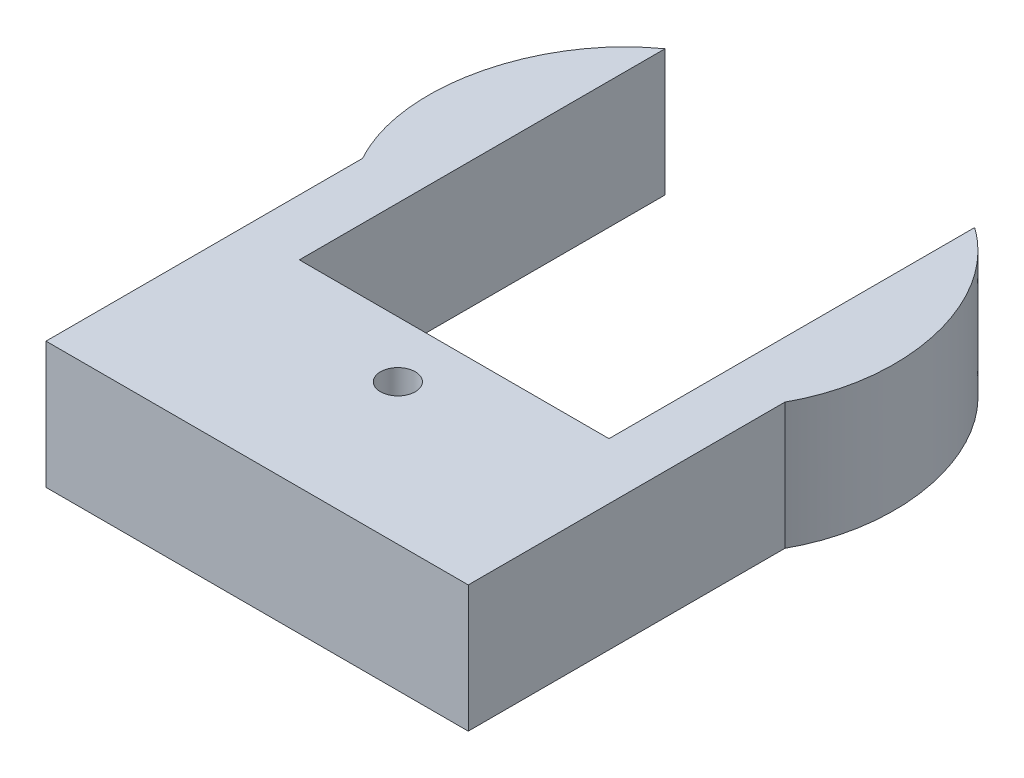
ISO-10303-21;
HEADER;
FILE_DESCRIPTION(('STEP AP214'),'2;1');
FILE_NAME('part.step','',(''),(''),'','','');
FILE_SCHEMA(('AUTOMOTIVE_DESIGN { 1 0 10303 214 1 1 1 1 }'));
ENDSEC;
DATA;
#1=APPLICATION_CONTEXT('core data for automotive mechanical design processes');
#2=APPLICATION_PROTOCOL_DEFINITION('international standard','automotive_design',2000,#1);
#3=PRODUCT_CONTEXT('',#1,'mechanical');
#4=PRODUCT('Part','Part','',(#3));
#5=PRODUCT_RELATED_PRODUCT_CATEGORY('part','',(#4));
#6=PRODUCT_DEFINITION_FORMATION('','',#4);
#7=PRODUCT_DEFINITION_CONTEXT('part definition',#1,'design');
#8=PRODUCT_DEFINITION('design','',#6,#7);
#9=PRODUCT_DEFINITION_SHAPE('','',#8);
#10=(LENGTH_UNIT() NAMED_UNIT(*) SI_UNIT(.MILLI.,.METRE.));
#11=(NAMED_UNIT(*) PLANE_ANGLE_UNIT() SI_UNIT($,.RADIAN.));
#12=(NAMED_UNIT(*) SI_UNIT($,.STERADIAN.) SOLID_ANGLE_UNIT());
#13=UNCERTAINTY_MEASURE_WITH_UNIT(LENGTH_MEASURE(1.E-05),#10,'distance_accuracy_value','');
#14=(GEOMETRIC_REPRESENTATION_CONTEXT(3) GLOBAL_UNCERTAINTY_ASSIGNED_CONTEXT((#13)) GLOBAL_UNIT_ASSIGNED_CONTEXT((#10,
#11,#12)) REPRESENTATION_CONTEXT('',''));
#15=CARTESIAN_POINT('',(0.,0.,0.));
#16=DIRECTION('',(0.,0.,1.));
#17=DIRECTION('',(1.,0.,0.));
#18=AXIS2_PLACEMENT_3D('',#15,#16,#17);
#19=CARTESIAN_POINT('',(0.,18.,0.));
#20=DIRECTION('',(0.,0.,-1.));
#21=DIRECTION('',(-1.,0.,0.));
#22=AXIS2_PLACEMENT_3D('',#19,#20,#21);
#23=PLANE('',#22);
#24=DIRECTION('',(1.,0.,0.));
#25=VECTOR('',#24,1.);
#26=CARTESIAN_POINT('',(0.,0.,0.));
#27=LINE('',#26,#25);
#28=CARTESIAN_POINT('',(0.,0.,0.));
#29=VERTEX_POINT('',#28);
#30=CARTESIAN_POINT('',(60.,0.,0.));
#31=VERTEX_POINT('',#30);
#32=EDGE_CURVE('E136',#29,#31,#27,.T.);
#33=ORIENTED_EDGE('',*,*,#32,.T.);
#34=DIRECTION('',(0.,-1.,0.));
#35=VECTOR('',#34,1.);
#36=CARTESIAN_POINT('',(60.,18.,0.));
#37=LINE('',#36,#35);
#38=CARTESIAN_POINT('',(60.,18.,0.));
#39=VERTEX_POINT('',#38);
#40=EDGE_CURVE('E41',#39,#31,#37,.T.);
#41=ORIENTED_EDGE('',*,*,#40,.F.);
#42=DIRECTION('',(1.,0.,0.));
#43=VECTOR('',#42,1.);
#44=CARTESIAN_POINT('',(0.,18.,0.));
#45=LINE('',#44,#43);
#46=CARTESIAN_POINT('',(0.,18.,0.));
#47=VERTEX_POINT('',#46);
#48=EDGE_CURVE('E92',#47,#39,#45,.T.);
#49=ORIENTED_EDGE('',*,*,#48,.F.);
#50=DIRECTION('',(0.,-1.,0.));
#51=VECTOR('',#50,1.);
#52=CARTESIAN_POINT('',(0.,18.,0.));
#53=LINE('',#52,#51);
#54=EDGE_CURVE('E11',#47,#29,#53,.T.);
#55=ORIENTED_EDGE('',*,*,#54,.T.);
#56=EDGE_LOOP('',(#33,#41,#49,#55));
#57=FACE_BOUND('',#56,.T.);
#58=ADVANCED_FACE('F33',(#57),#23,.F.);
#59=CARTESIAN_POINT('',(60.,18.,-28.));
#60=DIRECTION('',(-1.,0.,0.));
#61=DIRECTION('',(0.,0.,1.));
#62=AXIS2_PLACEMENT_3D('',#59,#60,#61);
#63=PLANE('',#62);
#64=DIRECTION('',(0.,0.,-1.));
#65=VECTOR('',#64,1.);
#66=CARTESIAN_POINT('',(60.,0.,-28.));
#67=LINE('',#66,#65);
#68=CARTESIAN_POINT('',(60.,0.,-45.));
#69=VERTEX_POINT('',#68);
#70=EDGE_CURVE('E190',#31,#69,#67,.T.);
#71=ORIENTED_EDGE('',*,*,#70,.T.);
#72=DIRECTION('',(0.,-1.,0.));
#73=VECTOR('',#72,1.);
#74=CARTESIAN_POINT('',(60.,18.,-45.));
#75=LINE('',#74,#73);
#76=CARTESIAN_POINT('',(60.,18.,-45.));
#77=VERTEX_POINT('',#76);
#78=EDGE_CURVE('E204',#77,#69,#75,.T.);
#79=ORIENTED_EDGE('',*,*,#78,.F.);
#80=DIRECTION('',(0.,0.,-1.));
#81=VECTOR('',#80,1.);
#82=CARTESIAN_POINT('',(60.,18.,0.));
#83=LINE('',#82,#81);
#84=EDGE_CURVE('E166',#39,#77,#83,.T.);
#85=ORIENTED_EDGE('',*,*,#84,.F.);
#86=ORIENTED_EDGE('',*,*,#40,.T.);
#87=EDGE_LOOP('',(#71,#79,#85,#86));
#88=FACE_BOUND('',#87,.T.);
#89=ADVANCED_FACE('F159',(#88),#63,.F.);
#90=CARTESIAN_POINT('',(60.,18.,-45.));
#91=CARTESIAN_POINT('',(64.2674134117202,18.,-52.7021578491893));
#92=CARTESIAN_POINT('',(63.8497104287764,18.,-67.2321104164456));
#93=CARTESIAN_POINT('',(55.427779911578,18.,-77.5248648328304));
#94=CARTESIAN_POINT('',(51.9999999999951,18.,-79.9540570080804));
#95=B_SPLINE_CURVE_WITH_KNOTS('',3,(#90,#91,#92,#93,#94),.UNSPECIFIED.,.F.,.F.,(4,1,4),(0.,
0.616858972813257,0.907352470321946),.UNSPECIFIED.);
#96=DIRECTION('',(0.,-1.,0.));
#97=VECTOR('',#96,1.);
#98=SURFACE_OF_LINEAR_EXTRUSION('',#95,#97);
#99=CARTESIAN_POINT('',(60.,0.,-45.));
#100=CARTESIAN_POINT('',(64.2674134117202,0.,-52.7021578491893));
#101=CARTESIAN_POINT('',(63.8497104287764,0.,-67.2321104164456));
#102=CARTESIAN_POINT('',(55.427779911578,0.,-77.5248648328304));
#103=CARTESIAN_POINT('',(51.9999999999951,0.,-79.9540570080804));
#104=B_SPLINE_CURVE_WITH_KNOTS('',3,(#99,#100,#101,#102,#103),.UNSPECIFIED.,.F.,.F.,(4,1,4),(0.,
0.616858972813257,0.907352470321946),.UNSPECIFIED.);
#105=CARTESIAN_POINT('',(51.9999999999951,0.,-79.9540570080804));
#106=VERTEX_POINT('',#105);
#107=EDGE_CURVE('E215',#69,#106,#104,.T.);
#108=ORIENTED_EDGE('',*,*,#107,.T.);
#109=DIRECTION('',(0.,-1.,0.));
#110=VECTOR('',#109,1.);
#111=CARTESIAN_POINT('',(51.9999999999951,18.,-79.9540570080804));
#112=LINE('',#111,#110);
#113=CARTESIAN_POINT('',(51.9999999999951,18.,-79.9540570080804));
#114=VERTEX_POINT('',#113);
#115=EDGE_CURVE('E201',#114,#106,#112,.T.);
#116=ORIENTED_EDGE('',*,*,#115,.F.);
#117=EDGE_CURVE('E161',#77,#114,#95,.T.);
#118=ORIENTED_EDGE('',*,*,#117,.F.);
#119=ORIENTED_EDGE('',*,*,#78,.T.);
#120=EDGE_LOOP('',(#108,#116,#118,#119));
#121=FACE_BOUND('',#120,.T.);
#122=ADVANCED_FACE('F155',(#121),#98,.F.);
#123=CARTESIAN_POINT('',(51.999999999995,18.,-28.));
#124=DIRECTION('',(1.,0.,0.));
#125=DIRECTION('',(0.,0.,-1.));
#126=AXIS2_PLACEMENT_3D('',#123,#124,#125);
#127=PLANE('',#126);
#128=DIRECTION('',(0.,0.,1.));
#129=VECTOR('',#128,1.);
#130=CARTESIAN_POINT('',(51.999999999995,0.,-28.));
#131=LINE('',#130,#129);
#132=CARTESIAN_POINT('',(51.999999999995,0.,-28.));
#133=VERTEX_POINT('',#132);
#134=EDGE_CURVE('E211',#106,#133,#131,.T.);
#135=ORIENTED_EDGE('',*,*,#134,.T.);
#136=DIRECTION('',(0.,-1.,0.));
#137=VECTOR('',#136,1.);
#138=CARTESIAN_POINT('',(51.999999999995,18.,-28.));
#139=LINE('',#138,#137);
#140=CARTESIAN_POINT('',(51.999999999995,18.,-28.));
#141=VERTEX_POINT('',#140);
#142=EDGE_CURVE('E122',#141,#133,#139,.T.);
#143=ORIENTED_EDGE('',*,*,#142,.F.);
#144=DIRECTION('',(0.,0.,1.));
#145=VECTOR('',#144,1.);
#146=CARTESIAN_POINT('',(51.999999999995,18.,-70.29729534041));
#147=LINE('',#146,#145);
#148=EDGE_CURVE('E112',#114,#141,#147,.T.);
#149=ORIENTED_EDGE('',*,*,#148,.F.);
#150=ORIENTED_EDGE('',*,*,#115,.T.);
#151=EDGE_LOOP('',(#135,#143,#149,#150));
#152=FACE_BOUND('',#151,.T.);
#153=ADVANCED_FACE('F152',(#152),#127,.F.);
#154=CARTESIAN_POINT('',(8.00000000000495,18.,-28.));
#155=DIRECTION('',(0.,0.,1.));
#156=DIRECTION('',(1.,0.,0.));
#157=AXIS2_PLACEMENT_3D('',#154,#155,#156);
#158=PLANE('',#157);
#159=DIRECTION('',(-1.,0.,0.));
#160=VECTOR('',#159,1.);
#161=CARTESIAN_POINT('',(8.00000000000495,0.,-28.));
#162=LINE('',#161,#160);
#163=CARTESIAN_POINT('',(8.00000000000495,0.,-28.));
#164=VERTEX_POINT('',#163);
#165=EDGE_CURVE('E121',#133,#164,#162,.T.);
#166=ORIENTED_EDGE('',*,*,#165,.T.);
#167=DIRECTION('',(0.,-1.,0.));
#168=VECTOR('',#167,1.);
#169=CARTESIAN_POINT('',(8.00000000000495,18.,-28.));
#170=LINE('',#169,#168);
#171=CARTESIAN_POINT('',(8.00000000000495,18.,-28.));
#172=VERTEX_POINT('',#171);
#173=EDGE_CURVE('E118',#172,#164,#170,.T.);
#174=ORIENTED_EDGE('',*,*,#173,.F.);
#175=DIRECTION('',(-1.,0.,0.));
#176=VECTOR('',#175,1.);
#177=CARTESIAN_POINT('',(8.00000000000495,18.,-28.));
#178=LINE('',#177,#176);
#179=EDGE_CURVE('E106',#141,#172,#178,.T.);
#180=ORIENTED_EDGE('',*,*,#179,.F.);
#181=ORIENTED_EDGE('',*,*,#142,.T.);
#182=EDGE_LOOP('',(#166,#174,#180,#181));
#183=FACE_BOUND('',#182,.T.);
#184=ADVANCED_FACE('F119',(#183),#158,.F.);
#185=CARTESIAN_POINT('',(8.00000000000495,18.,-67.5014987303513));
#186=DIRECTION('',(-1.,0.,0.));
#187=DIRECTION('',(0.,0.,1.));
#188=AXIS2_PLACEMENT_3D('',#185,#186,#187);
#189=PLANE('',#188);
#190=DIRECTION('',(0.,0.,-1.));
#191=VECTOR('',#190,1.);
#192=CARTESIAN_POINT('',(8.00000000000495,0.,-67.5014987303513));
#193=LINE('',#192,#191);
#194=CARTESIAN_POINT('',(8.00000000000495,0.,-79.9540570080804));
#195=VERTEX_POINT('',#194);
#196=EDGE_CURVE('E78',#164,#195,#193,.T.);
#197=ORIENTED_EDGE('',*,*,#196,.T.);
#198=DIRECTION('',(0.,-1.,0.));
#199=VECTOR('',#198,1.);
#200=CARTESIAN_POINT('',(8.00000000000495,18.,-79.9540570080804));
#201=LINE('',#200,#199);
#202=CARTESIAN_POINT('',(8.00000000000495,18.,-79.9540570080804));
#203=VERTEX_POINT('',#202);
#204=EDGE_CURVE('E123',#203,#195,#201,.T.);
#205=ORIENTED_EDGE('',*,*,#204,.F.);
#206=DIRECTION('',(0.,0.,-1.));
#207=VECTOR('',#206,1.);
#208=CARTESIAN_POINT('',(8.00000000000495,18.,-28.));
#209=LINE('',#208,#207);
#210=EDGE_CURVE('E110',#172,#203,#209,.T.);
#211=ORIENTED_EDGE('',*,*,#210,.F.);
#212=ORIENTED_EDGE('',*,*,#173,.T.);
#213=EDGE_LOOP('',(#197,#205,#211,#212));
#214=FACE_BOUND('',#213,.T.);
#215=ADVANCED_FACE('F125',(#214),#189,.F.);
#216=CARTESIAN_POINT('',(8.00000000000495,18.,-79.9540570080804));
#217=CARTESIAN_POINT('',(4.57222008842203,18.,-77.5248648328304));
#218=CARTESIAN_POINT('',(-3.8497104287764,18.,-67.2321104164456));
#219=CARTESIAN_POINT('',(-4.2674134117202,18.,-52.7021578491893));
#220=CARTESIAN_POINT('',(0.,18.,-45.));
#221=B_SPLINE_CURVE_WITH_KNOTS('',3,(#216,#217,#218,#219,#220),.UNSPECIFIED.,.F.,.F.,(4,1,4),
(0.,0.290493497508689,0.907352470321946),.UNSPECIFIED.);
#222=DIRECTION('',(0.,-1.,0.));
#223=VECTOR('',#222,1.);
#224=SURFACE_OF_LINEAR_EXTRUSION('',#221,#223);
#225=CARTESIAN_POINT('',(8.00000000000495,0.,-79.9540570080804));
#226=CARTESIAN_POINT('',(4.57222008842203,0.,-77.5248648328304));
#227=CARTESIAN_POINT('',(-3.8497104287764,0.,-67.2321104164456));
#228=CARTESIAN_POINT('',(-4.2674134117202,0.,-52.7021578491893));
#229=CARTESIAN_POINT('',(0.,0.,-45.));
#230=B_SPLINE_CURVE_WITH_KNOTS('',3,(#225,#226,#227,#228,#229),.UNSPECIFIED.,.F.,.F.,(4,1,4),
(0.,0.290493497508689,0.907352470321946),.UNSPECIFIED.);
#231=CARTESIAN_POINT('',(0.,0.,-45.));
#232=VERTEX_POINT('',#231);
#233=EDGE_CURVE('E85',#195,#232,#230,.T.);
#234=ORIENTED_EDGE('',*,*,#233,.T.);
#235=DIRECTION('',(0.,-1.,0.));
#236=VECTOR('',#235,1.);
#237=CARTESIAN_POINT('',(0.,18.,-45.));
#238=LINE('',#237,#236);
#239=CARTESIAN_POINT('',(0.,18.,-45.));
#240=VERTEX_POINT('',#239);
#241=EDGE_CURVE('E129',#240,#232,#238,.T.);
#242=ORIENTED_EDGE('',*,*,#241,.F.);
#243=EDGE_CURVE('E127',#203,#240,#221,.T.);
#244=ORIENTED_EDGE('',*,*,#243,.F.);
#245=ORIENTED_EDGE('',*,*,#204,.T.);
#246=EDGE_LOOP('',(#234,#242,#244,#245));
#247=FACE_BOUND('',#246,.T.);
#248=ADVANCED_FACE('F142',(#247),#224,.F.);
#249=CARTESIAN_POINT('',(0.,18.,-28.));
#250=DIRECTION('',(1.,0.,0.));
#251=DIRECTION('',(0.,0.,-1.));
#252=AXIS2_PLACEMENT_3D('',#249,#250,#251);
#253=PLANE('',#252);
#254=DIRECTION('',(0.,0.,1.));
#255=VECTOR('',#254,1.);
#256=CARTESIAN_POINT('',(0.,0.,-28.));
#257=LINE('',#256,#255);
#258=EDGE_CURVE('E173',#232,#29,#257,.T.);
#259=ORIENTED_EDGE('',*,*,#258,.T.);
#260=ORIENTED_EDGE('',*,*,#54,.F.);
#261=DIRECTION('',(0.,0.,1.));
#262=VECTOR('',#261,1.);
#263=CARTESIAN_POINT('',(0.,18.,0.));
#264=LINE('',#263,#262);
#265=EDGE_CURVE('E49',#240,#47,#264,.T.);
#266=ORIENTED_EDGE('',*,*,#265,.F.);
#267=ORIENTED_EDGE('',*,*,#241,.T.);
#268=EDGE_LOOP('',(#259,#260,#266,#267));
#269=FACE_BOUND('',#268,.T.);
#270=ADVANCED_FACE('F146',(#269),#253,.F.);
#271=CARTESIAN_POINT('',(-2.36887368427162,18.,-63.880180178717));
#272=DIRECTION('',(0.,1.,0.));
#273=DIRECTION('',(0.,0.,1.));
#274=AXIS2_PLACEMENT_3D('',#271,#272,#273);
#275=PLANE('',#274);
#276=CARTESIAN_POINT('',(30.,18.,-20.));
#277=DIRECTION('',(0.,1.,0.));
#278=DIRECTION('',(0.,0.,1.));
#279=AXIS2_PLACEMENT_3D('',#276,#277,#278);
#280=CIRCLE('',#279,2.46971811595379);
#281=CARTESIAN_POINT('',(30.,18.,-17.5302818840462));
#282=VERTEX_POINT('',#281);
#283=EDGE_CURVE('E174',#282,#282,#280,.T.);
#284=ORIENTED_EDGE('',*,*,#283,.F.);
#285=EDGE_LOOP('',(#284));
#286=FACE_BOUND('',#285,.T.);
#287=ORIENTED_EDGE('',*,*,#265,.T.);
#288=ORIENTED_EDGE('',*,*,#48,.T.);
#289=ORIENTED_EDGE('',*,*,#84,.T.);
#290=ORIENTED_EDGE('',*,*,#117,.T.);
#291=ORIENTED_EDGE('',*,*,#148,.T.);
#292=ORIENTED_EDGE('',*,*,#179,.T.);
#293=ORIENTED_EDGE('',*,*,#210,.T.);
#294=ORIENTED_EDGE('',*,*,#243,.T.);
#295=EDGE_LOOP('',(#287,#288,#289,#290,#291,#292,#293,#294));
#296=FACE_BOUND('',#295,.T.);
#297=ADVANCED_FACE('F108',(#286,#296),#275,.T.);
#298=CARTESIAN_POINT('',(-2.36887368427162,0.,-63.880180178717));
#299=DIRECTION('',(0.,1.,0.));
#300=DIRECTION('',(0.,0.,1.));
#301=AXIS2_PLACEMENT_3D('',#298,#299,#300);
#302=PLANE('',#301);
#303=CARTESIAN_POINT('',(30.,0.,-20.));
#304=DIRECTION('',(0.,-1.,0.));
#305=DIRECTION('',(0.,0.,-1.));
#306=AXIS2_PLACEMENT_3D('',#303,#304,#305);
#307=CIRCLE('',#306,2.46971811595379);
#308=CARTESIAN_POINT('',(30.,0.,-22.4697181159538));
#309=VERTEX_POINT('',#308);
#310=EDGE_CURVE('E177',#309,#309,#307,.T.);
#311=ORIENTED_EDGE('',*,*,#310,.F.);
#312=EDGE_LOOP('',(#311));
#313=FACE_BOUND('',#312,.T.);
#314=ORIENTED_EDGE('',*,*,#32,.F.);
#315=ORIENTED_EDGE('',*,*,#258,.F.);
#316=ORIENTED_EDGE('',*,*,#233,.F.);
#317=ORIENTED_EDGE('',*,*,#196,.F.);
#318=ORIENTED_EDGE('',*,*,#165,.F.);
#319=ORIENTED_EDGE('',*,*,#134,.F.);
#320=ORIENTED_EDGE('',*,*,#107,.F.);
#321=ORIENTED_EDGE('',*,*,#70,.F.);
#322=EDGE_LOOP('',(#314,#315,#316,#317,#318,#319,#320,#321));
#323=FACE_BOUND('',#322,.T.);
#324=ADVANCED_FACE('F183',(#313,#323),#302,.F.);
#325=CARTESIAN_POINT('',(30.,21.,-20.));
#326=DIRECTION('',(0.,-1.,0.));
#327=DIRECTION('',(0.,0.,-1.));
#328=AXIS2_PLACEMENT_3D('',#325,#326,#327);
#329=CYLINDRICAL_SURFACE('',#328,2.46971811595379);
#330=ORIENTED_EDGE('',*,*,#283,.T.);
#331=EDGE_LOOP('',(#330));
#332=FACE_BOUND('',#331,.T.);
#333=ORIENTED_EDGE('',*,*,#310,.T.);
#334=EDGE_LOOP('',(#333));
#335=FACE_BOUND('',#334,.T.);
#336=ADVANCED_FACE('F181',(#332,#335),#329,.F.);
#337=CLOSED_SHELL('',(#58,#89,#122,#153,#184,#215,#248,#270,#297,#324,#336));
#338=MANIFOLD_SOLID_BREP('B2',#337);
#339=ADVANCED_BREP_SHAPE_REPRESENTATION('',(#18,#338),#14);
#340=SHAPE_DEFINITION_REPRESENTATION(#9,#339);
ENDSEC;
END-ISO-10303-21;
